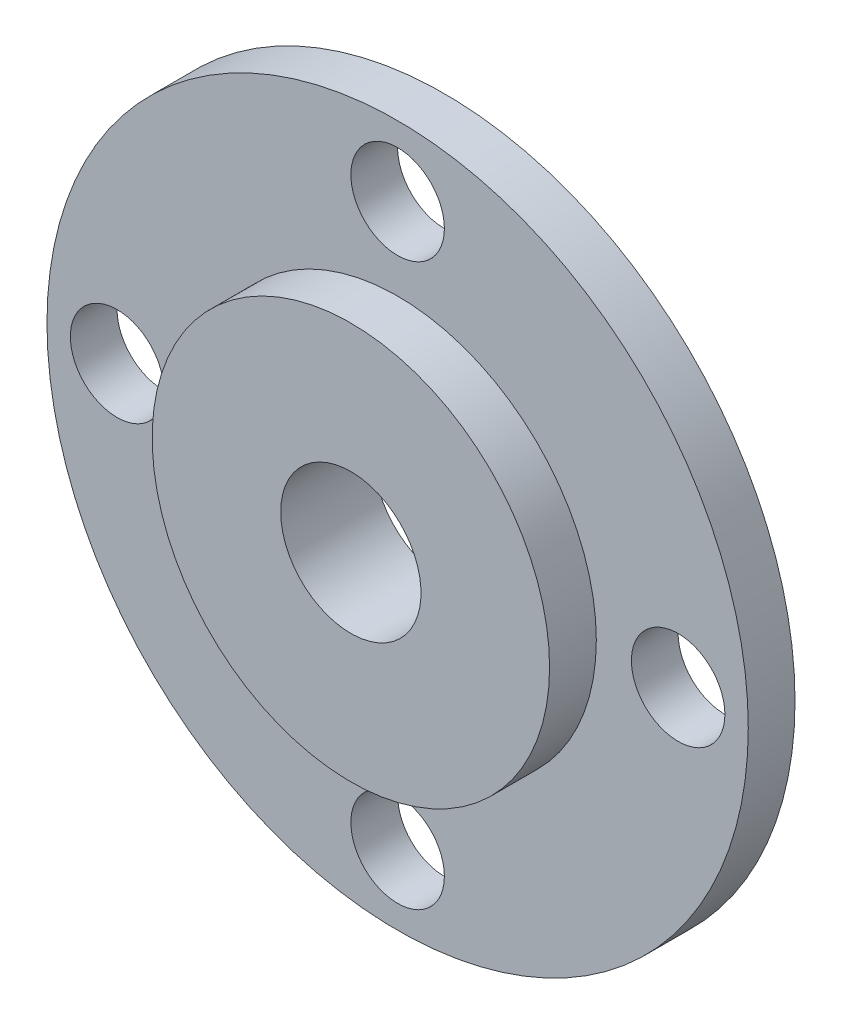
ISO-10303-21;
HEADER;
FILE_DESCRIPTION(('STEP AP214'),'2;1');
FILE_NAME('part.step','',(''),(''),'','','');
FILE_SCHEMA(('AUTOMOTIVE_DESIGN { 1 0 10303 214 1 1 1 1 }'));
ENDSEC;
DATA;
#1=APPLICATION_CONTEXT('core data for automotive mechanical design processes');
#2=APPLICATION_PROTOCOL_DEFINITION('international standard','automotive_design',2000,#1);
#3=PRODUCT_CONTEXT('',#1,'mechanical');
#4=PRODUCT('Part','Part','',(#3));
#5=PRODUCT_RELATED_PRODUCT_CATEGORY('part','',(#4));
#6=PRODUCT_DEFINITION_FORMATION('','',#4);
#7=PRODUCT_DEFINITION_CONTEXT('part definition',#1,'design');
#8=PRODUCT_DEFINITION('design','',#6,#7);
#9=PRODUCT_DEFINITION_SHAPE('','',#8);
#10=(LENGTH_UNIT() NAMED_UNIT(*) SI_UNIT(.MILLI.,.METRE.));
#11=(NAMED_UNIT(*) PLANE_ANGLE_UNIT() SI_UNIT($,.RADIAN.));
#12=(NAMED_UNIT(*) SI_UNIT($,.STERADIAN.) SOLID_ANGLE_UNIT());
#13=UNCERTAINTY_MEASURE_WITH_UNIT(LENGTH_MEASURE(1.E-05),#10,'distance_accuracy_value','');
#14=(GEOMETRIC_REPRESENTATION_CONTEXT(3) GLOBAL_UNCERTAINTY_ASSIGNED_CONTEXT((#13)) GLOBAL_UNIT_ASSIGNED_CONTEXT((#10,
#11,#12)) REPRESENTATION_CONTEXT('',''));
#15=CARTESIAN_POINT('',(0.,0.,0.));
#16=DIRECTION('',(0.,0.,1.));
#17=DIRECTION('',(1.,0.,0.));
#18=AXIS2_PLACEMENT_3D('',#15,#16,#17);
#19=CARTESIAN_POINT('',(0.,0.,1.));
#20=DIRECTION('',(0.,0.,-1.));
#21=DIRECTION('',(-1.,0.,0.));
#22=AXIS2_PLACEMENT_3D('',#19,#20,#21);
#23=CYLINDRICAL_SURFACE('',#22,4.25);
#24=CARTESIAN_POINT('',(0.,0.,1.));
#25=DIRECTION('',(0.,0.,1.));
#26=DIRECTION('',(1.,0.,0.));
#27=AXIS2_PLACEMENT_3D('',#24,#25,#26);
#28=CIRCLE('',#27,4.25);
#29=CARTESIAN_POINT('',(4.25,0.,1.));
#30=VERTEX_POINT('',#29);
#31=EDGE_CURVE('E10',#30,#30,#28,.T.);
#32=ORIENTED_EDGE('',*,*,#31,.F.);
#33=EDGE_LOOP('',(#32));
#34=FACE_BOUND('',#33,.T.);
#35=CARTESIAN_POINT('',(0.,0.,0.));
#36=DIRECTION('',(0.,0.,1.));
#37=DIRECTION('',(1.,0.,0.));
#38=AXIS2_PLACEMENT_3D('',#35,#36,#37);
#39=CIRCLE('',#38,4.25);
#40=CARTESIAN_POINT('',(4.25,0.,0.));
#41=VERTEX_POINT('',#40);
#42=EDGE_CURVE('E40',#41,#41,#39,.T.);
#43=ORIENTED_EDGE('',*,*,#42,.T.);
#44=EDGE_LOOP('',(#43));
#45=FACE_BOUND('',#44,.T.);
#46=ADVANCED_FACE('F37',(#34,#45),#23,.T.);
#47=CARTESIAN_POINT('',(0.,0.,1.));
#48=DIRECTION('',(0.,0.,1.));
#49=DIRECTION('',(1.,0.,0.));
#50=AXIS2_PLACEMENT_3D('',#47,#48,#49);
#51=PLANE('',#50);
#52=CARTESIAN_POINT('',(0.,0.,1.));
#53=DIRECTION('',(0.,0.,-1.));
#54=DIRECTION('',(-1.,0.,0.));
#55=AXIS2_PLACEMENT_3D('',#52,#53,#54);
#56=CIRCLE('',#55,1.5);
#57=CARTESIAN_POINT('',(-1.5,0.,1.));
#58=VERTEX_POINT('',#57);
#59=EDGE_CURVE('E64',#58,#58,#56,.T.);
#60=ORIENTED_EDGE('',*,*,#59,.T.);
#61=EDGE_LOOP('',(#60));
#62=FACE_BOUND('',#61,.T.);
#63=ORIENTED_EDGE('',*,*,#31,.T.);
#64=EDGE_LOOP('',(#63));
#65=FACE_BOUND('',#64,.T.);
#66=ADVANCED_FACE('F99',(#62,#65),#51,.T.);
#67=CARTESIAN_POINT('',(0.,0.,-1.));
#68=DIRECTION('',(0.,0.,1.));
#69=DIRECTION('',(1.,0.,0.));
#70=AXIS2_PLACEMENT_3D('',#67,#68,#69);
#71=CYLINDRICAL_SURFACE('',#70,7.5);
#72=CARTESIAN_POINT('',(0.,0.,-1.));
#73=DIRECTION('',(0.,0.,-1.));
#74=DIRECTION('',(-1.,0.,0.));
#75=AXIS2_PLACEMENT_3D('',#72,#73,#74);
#76=CIRCLE('',#75,7.5);
#77=CARTESIAN_POINT('',(-7.5,0.,-1.));
#78=VERTEX_POINT('',#77);
#79=EDGE_CURVE('E49',#78,#78,#76,.T.);
#80=ORIENTED_EDGE('',*,*,#79,.F.);
#81=EDGE_LOOP('',(#80));
#82=FACE_BOUND('',#81,.T.);
#83=CARTESIAN_POINT('',(0.,0.,0.));
#84=DIRECTION('',(0.,0.,-1.));
#85=DIRECTION('',(-1.,0.,0.));
#86=AXIS2_PLACEMENT_3D('',#83,#84,#85);
#87=CIRCLE('',#86,7.5);
#88=CARTESIAN_POINT('',(-7.5,0.,0.));
#89=VERTEX_POINT('',#88);
#90=EDGE_CURVE('E51',#89,#89,#87,.T.);
#91=ORIENTED_EDGE('',*,*,#90,.T.);
#92=EDGE_LOOP('',(#91));
#93=FACE_BOUND('',#92,.T.);
#94=ADVANCED_FACE('F112',(#82,#93),#71,.T.);
#95=CARTESIAN_POINT('',(0.,0.,-1.));
#96=DIRECTION('',(0.,0.,-1.));
#97=DIRECTION('',(-1.,0.,0.));
#98=AXIS2_PLACEMENT_3D('',#95,#96,#97);
#99=PLANE('',#98);
#100=CARTESIAN_POINT('',(0.,0.,-1.));
#101=DIRECTION('',(0.,0.,-1.));
#102=DIRECTION('',(-1.,0.,0.));
#103=AXIS2_PLACEMENT_3D('',#100,#101,#102);
#104=CIRCLE('',#103,1.5);
#105=CARTESIAN_POINT('',(-1.5,0.,-1.));
#106=VERTEX_POINT('',#105);
#107=EDGE_CURVE('E91',#106,#106,#104,.T.);
#108=ORIENTED_EDGE('',*,*,#107,.F.);
#109=EDGE_LOOP('',(#108));
#110=FACE_BOUND('',#109,.T.);
#111=CARTESIAN_POINT('',(6.,0.,-1.));
#112=DIRECTION('',(0.,0.,1.));
#113=DIRECTION('',(1.,0.,0.));
#114=AXIS2_PLACEMENT_3D('',#111,#112,#113);
#115=CIRCLE('',#114,1.);
#116=CARTESIAN_POINT('',(7.,0.,-1.));
#117=VERTEX_POINT('',#116);
#118=EDGE_CURVE('E55',#117,#117,#115,.T.);
#119=ORIENTED_EDGE('',*,*,#118,.T.);
#120=EDGE_LOOP('',(#119));
#121=FACE_BOUND('',#120,.T.);
#122=CARTESIAN_POINT('',(0.,6.,-1.));
#123=DIRECTION('',(0.,0.,1.));
#124=DIRECTION('',(1.,0.,0.));
#125=AXIS2_PLACEMENT_3D('',#122,#123,#124);
#126=CIRCLE('',#125,1.);
#127=CARTESIAN_POINT('',(1.,6.,-1.));
#128=VERTEX_POINT('',#127);
#129=EDGE_CURVE('E80',#128,#128,#126,.T.);
#130=ORIENTED_EDGE('',*,*,#129,.T.);
#131=EDGE_LOOP('',(#130));
#132=FACE_BOUND('',#131,.T.);
#133=CARTESIAN_POINT('',(-6.,0.,-1.));
#134=DIRECTION('',(0.,0.,1.));
#135=DIRECTION('',(1.,0.,0.));
#136=AXIS2_PLACEMENT_3D('',#133,#134,#135);
#137=CIRCLE('',#136,1.);
#138=CARTESIAN_POINT('',(-5.,0.,-1.));
#139=VERTEX_POINT('',#138);
#140=EDGE_CURVE('E72',#139,#139,#137,.T.);
#141=ORIENTED_EDGE('',*,*,#140,.T.);
#142=EDGE_LOOP('',(#141));
#143=FACE_BOUND('',#142,.T.);
#144=CARTESIAN_POINT('',(0.,-6.,-1.));
#145=DIRECTION('',(0.,0.,1.));
#146=DIRECTION('',(1.,0.,0.));
#147=AXIS2_PLACEMENT_3D('',#144,#145,#146);
#148=CIRCLE('',#147,1.);
#149=CARTESIAN_POINT('',(1.,-6.,-1.));
#150=VERTEX_POINT('',#149);
#151=EDGE_CURVE('E63',#150,#150,#148,.T.);
#152=ORIENTED_EDGE('',*,*,#151,.T.);
#153=EDGE_LOOP('',(#152));
#154=FACE_BOUND('',#153,.T.);
#155=ORIENTED_EDGE('',*,*,#79,.T.);
#156=EDGE_LOOP('',(#155));
#157=FACE_BOUND('',#156,.T.);
#158=ADVANCED_FACE('F108',(#110,#121,#132,#143,#154,#157),#99,.T.);
#159=CARTESIAN_POINT('',(0.,0.,0.));
#160=DIRECTION('',(0.,0.,-1.));
#161=DIRECTION('',(-1.,0.,0.));
#162=AXIS2_PLACEMENT_3D('',#159,#160,#161);
#163=PLANE('',#162);
#164=CARTESIAN_POINT('',(6.,0.,0.));
#165=DIRECTION('',(0.,0.,1.));
#166=DIRECTION('',(1.,0.,0.));
#167=AXIS2_PLACEMENT_3D('',#164,#165,#166);
#168=CIRCLE('',#167,1.);
#169=CARTESIAN_POINT('',(7.,0.,0.));
#170=VERTEX_POINT('',#169);
#171=EDGE_CURVE('E84',#170,#170,#168,.T.);
#172=ORIENTED_EDGE('',*,*,#171,.F.);
#173=EDGE_LOOP('',(#172));
#174=FACE_BOUND('',#173,.T.);
#175=CARTESIAN_POINT('',(0.,6.,0.));
#176=DIRECTION('',(0.,0.,1.));
#177=DIRECTION('',(1.,0.,0.));
#178=AXIS2_PLACEMENT_3D('',#175,#176,#177);
#179=CIRCLE('',#178,1.);
#180=CARTESIAN_POINT('',(1.,6.,0.));
#181=VERTEX_POINT('',#180);
#182=EDGE_CURVE('E76',#181,#181,#179,.T.);
#183=ORIENTED_EDGE('',*,*,#182,.F.);
#184=EDGE_LOOP('',(#183));
#185=FACE_BOUND('',#184,.T.);
#186=CARTESIAN_POINT('',(-6.,0.,0.));
#187=DIRECTION('',(0.,0.,1.));
#188=DIRECTION('',(1.,0.,0.));
#189=AXIS2_PLACEMENT_3D('',#186,#187,#188);
#190=CIRCLE('',#189,1.);
#191=CARTESIAN_POINT('',(-5.,0.,0.));
#192=VERTEX_POINT('',#191);
#193=EDGE_CURVE('E68',#192,#192,#190,.T.);
#194=ORIENTED_EDGE('',*,*,#193,.F.);
#195=EDGE_LOOP('',(#194));
#196=FACE_BOUND('',#195,.T.);
#197=CARTESIAN_POINT('',(0.,-6.,0.));
#198=DIRECTION('',(0.,0.,1.));
#199=DIRECTION('',(1.,0.,0.));
#200=AXIS2_PLACEMENT_3D('',#197,#198,#199);
#201=CIRCLE('',#200,1.);
#202=CARTESIAN_POINT('',(1.,-6.,0.));
#203=VERTEX_POINT('',#202);
#204=EDGE_CURVE('E59',#203,#203,#201,.T.);
#205=ORIENTED_EDGE('',*,*,#204,.F.);
#206=EDGE_LOOP('',(#205));
#207=FACE_BOUND('',#206,.T.);
#208=ORIENTED_EDGE('',*,*,#42,.F.);
#209=EDGE_LOOP('',(#208));
#210=FACE_BOUND('',#209,.T.);
#211=ORIENTED_EDGE('',*,*,#90,.F.);
#212=EDGE_LOOP('',(#211));
#213=FACE_BOUND('',#212,.T.);
#214=ADVANCED_FACE('F111',(#174,#185,#196,#207,#210,#213),#163,.F.);
#215=CARTESIAN_POINT('',(0.,-6.,-1.));
#216=DIRECTION('',(0.,0.,1.));
#217=DIRECTION('',(1.,0.,0.));
#218=AXIS2_PLACEMENT_3D('',#215,#216,#217);
#219=CYLINDRICAL_SURFACE('',#218,1.);
#220=ORIENTED_EDGE('',*,*,#151,.F.);
#221=EDGE_LOOP('',(#220));
#222=FACE_BOUND('',#221,.T.);
#223=ORIENTED_EDGE('',*,*,#204,.T.);
#224=EDGE_LOOP('',(#223));
#225=FACE_BOUND('',#224,.T.);
#226=ADVANCED_FACE('F130',(#222,#225),#219,.F.);
#227=CARTESIAN_POINT('',(-6.,0.,-1.));
#228=DIRECTION('',(0.,0.,1.));
#229=DIRECTION('',(1.,0.,0.));
#230=AXIS2_PLACEMENT_3D('',#227,#228,#229);
#231=CYLINDRICAL_SURFACE('',#230,1.);
#232=ORIENTED_EDGE('',*,*,#140,.F.);
#233=EDGE_LOOP('',(#232));
#234=FACE_BOUND('',#233,.T.);
#235=ORIENTED_EDGE('',*,*,#193,.T.);
#236=EDGE_LOOP('',(#235));
#237=FACE_BOUND('',#236,.T.);
#238=ADVANCED_FACE('F136',(#234,#237),#231,.F.);
#239=CARTESIAN_POINT('',(0.,6.,-1.));
#240=DIRECTION('',(0.,0.,1.));
#241=DIRECTION('',(1.,0.,0.));
#242=AXIS2_PLACEMENT_3D('',#239,#240,#241);
#243=CYLINDRICAL_SURFACE('',#242,1.);
#244=ORIENTED_EDGE('',*,*,#129,.F.);
#245=EDGE_LOOP('',(#244));
#246=FACE_BOUND('',#245,.T.);
#247=ORIENTED_EDGE('',*,*,#182,.T.);
#248=EDGE_LOOP('',(#247));
#249=FACE_BOUND('',#248,.T.);
#250=ADVANCED_FACE('F175',(#246,#249),#243,.F.);
#251=CARTESIAN_POINT('',(6.,0.,-1.));
#252=DIRECTION('',(0.,0.,1.));
#253=DIRECTION('',(1.,0.,0.));
#254=AXIS2_PLACEMENT_3D('',#251,#252,#253);
#255=CYLINDRICAL_SURFACE('',#254,1.);
#256=ORIENTED_EDGE('',*,*,#118,.F.);
#257=EDGE_LOOP('',(#256));
#258=FACE_BOUND('',#257,.T.);
#259=ORIENTED_EDGE('',*,*,#171,.T.);
#260=EDGE_LOOP('',(#259));
#261=FACE_BOUND('',#260,.T.);
#262=ADVANCED_FACE('F104',(#258,#261),#255,.F.);
#263=CARTESIAN_POINT('',(0.,0.,1.));
#264=DIRECTION('',(0.,0.,-1.));
#265=DIRECTION('',(-1.,0.,0.));
#266=AXIS2_PLACEMENT_3D('',#263,#264,#265);
#267=CYLINDRICAL_SURFACE('',#266,1.5);
#268=ORIENTED_EDGE('',*,*,#59,.F.);
#269=EDGE_LOOP('',(#268));
#270=FACE_BOUND('',#269,.T.);
#271=ORIENTED_EDGE('',*,*,#107,.T.);
#272=EDGE_LOOP('',(#271));
#273=FACE_BOUND('',#272,.T.);
#274=ADVANCED_FACE('F101',(#270,#273),#267,.F.);
#275=CLOSED_SHELL('',(#46,#66,#94,#158,#214,#226,#238,#250,#262,#274));
#276=MANIFOLD_SOLID_BREP('B2',#275);
#277=ADVANCED_BREP_SHAPE_REPRESENTATION('',(#18,#276),#14);
#278=SHAPE_DEFINITION_REPRESENTATION(#9,#277);
ENDSEC;
END-ISO-10303-21;
